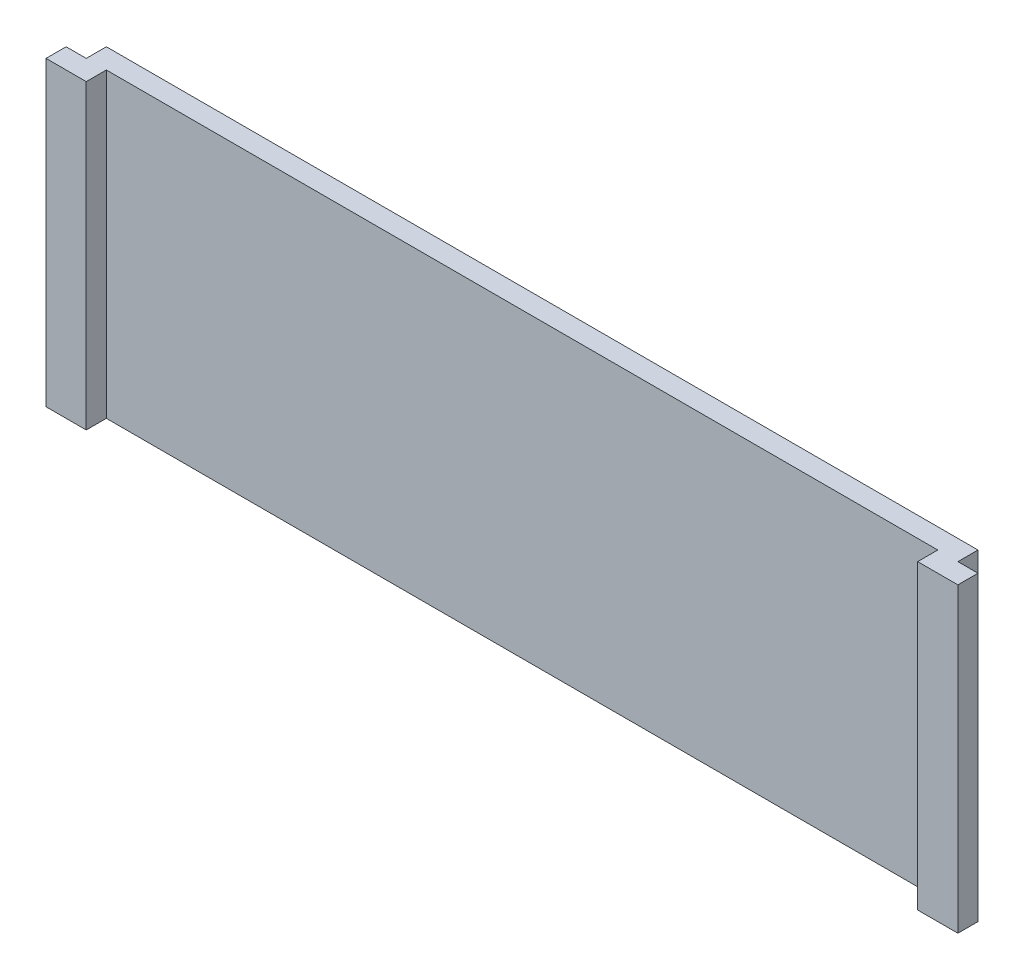
ISO-10303-21;
HEADER;
FILE_DESCRIPTION(('STEP AP214'),'2;1');
FILE_NAME('part.step','',(''),(''),'','','');
FILE_SCHEMA(('AUTOMOTIVE_DESIGN { 1 0 10303 214 1 1 1 1 }'));
ENDSEC;
DATA;
#1=APPLICATION_CONTEXT('core data for automotive mechanical design processes');
#2=APPLICATION_PROTOCOL_DEFINITION('international standard','automotive_design',2000,#1);
#3=PRODUCT_CONTEXT('',#1,'mechanical');
#4=PRODUCT('Part','Part','',(#3));
#5=PRODUCT_RELATED_PRODUCT_CATEGORY('part','',(#4));
#6=PRODUCT_DEFINITION_FORMATION('','',#4);
#7=PRODUCT_DEFINITION_CONTEXT('part definition',#1,'design');
#8=PRODUCT_DEFINITION('design','',#6,#7);
#9=PRODUCT_DEFINITION_SHAPE('','',#8);
#10=(LENGTH_UNIT() NAMED_UNIT(*) SI_UNIT(.MILLI.,.METRE.));
#11=(NAMED_UNIT(*) PLANE_ANGLE_UNIT() SI_UNIT($,.RADIAN.));
#12=(NAMED_UNIT(*) SI_UNIT($,.STERADIAN.) SOLID_ANGLE_UNIT());
#13=UNCERTAINTY_MEASURE_WITH_UNIT(LENGTH_MEASURE(1.E-05),#10,'distance_accuracy_value','');
#14=(GEOMETRIC_REPRESENTATION_CONTEXT(3) GLOBAL_UNCERTAINTY_ASSIGNED_CONTEXT((#13)) GLOBAL_UNIT_ASSIGNED_CONTEXT((#10,
#11,#12)) REPRESENTATION_CONTEXT('',''));
#15=CARTESIAN_POINT('',(0.,0.,0.));
#16=DIRECTION('',(0.,0.,1.));
#17=DIRECTION('',(1.,0.,0.));
#18=AXIS2_PLACEMENT_3D('',#15,#16,#17);
#19=CARTESIAN_POINT('',(0.,0.,3.));
#20=DIRECTION('',(0.,0.,1.));
#21=DIRECTION('',(1.,0.,0.));
#22=AXIS2_PLACEMENT_3D('',#19,#20,#21);
#23=PLANE('',#22);
#24=DIRECTION('',(1.,0.,0.));
#25=VECTOR('',#24,1.);
#26=CARTESIAN_POINT('',(-13.7646933247942,-11.2650602409639,3.));
#27=LINE('',#26,#25);
#28=CARTESIAN_POINT('',(-10.7646933247942,-11.2650602409639,3.));
#29=VERTEX_POINT('',#28);
#30=CARTESIAN_POINT('',(113.235306675206,-11.2650602409639,3.));
#31=VERTEX_POINT('',#30);
#32=EDGE_CURVE('E57',#29,#31,#27,.T.);
#33=ORIENTED_EDGE('',*,*,#32,.T.);
#34=DIRECTION('',(0.,-1.,0.));
#35=VECTOR('',#34,1.);
#36=CARTESIAN_POINT('',(113.235306675206,0.,3.));
#37=LINE('',#36,#35);
#38=CARTESIAN_POINT('',(113.235306675206,33.7349397590361,3.));
#39=VERTEX_POINT('',#38);
#40=EDGE_CURVE('E175',#39,#31,#37,.T.);
#41=ORIENTED_EDGE('',*,*,#40,.F.);
#42=DIRECTION('',(-1.,0.,0.));
#43=VECTOR('',#42,1.);
#44=CARTESIAN_POINT('',(-13.7646933247942,33.7349397590361,3.));
#45=LINE('',#44,#43);
#46=CARTESIAN_POINT('',(-10.7646933247942,33.7349397590361,3.));
#47=VERTEX_POINT('',#46);
#48=EDGE_CURVE('E239',#39,#47,#45,.T.);
#49=ORIENTED_EDGE('',*,*,#48,.T.);
#50=DIRECTION('',(0.,-1.,0.));
#51=VECTOR('',#50,1.);
#52=CARTESIAN_POINT('',(-10.7646933247942,0.,3.));
#53=LINE('',#52,#51);
#54=EDGE_CURVE('E210',#47,#29,#53,.T.);
#55=ORIENTED_EDGE('',*,*,#54,.T.);
#56=EDGE_LOOP('',(#33,#41,#49,#55));
#57=FACE_BOUND('',#56,.T.);
#58=ADVANCED_FACE('F41',(#57),#23,.T.);
#59=CARTESIAN_POINT('',(-13.7646933247942,33.7349397590361,3.));
#60=DIRECTION('',(1.,0.,0.));
#61=DIRECTION('',(0.,1.,0.));
#62=AXIS2_PLACEMENT_3D('',#59,#60,#61);
#63=PLANE('',#62);
#64=DIRECTION('',(0.,-1.,0.));
#65=VECTOR('',#64,1.);
#66=CARTESIAN_POINT('',(-13.7646933247942,33.7349397590361,0.));
#67=LINE('',#66,#65);
#68=CARTESIAN_POINT('',(-13.7646933247942,33.7349397590361,0.));
#69=VERTEX_POINT('',#68);
#70=CARTESIAN_POINT('',(-13.7646933247942,-11.2650602409639,0.));
#71=VERTEX_POINT('',#70);
#72=EDGE_CURVE('E228',#69,#71,#67,.T.);
#73=ORIENTED_EDGE('',*,*,#72,.T.);
#74=DIRECTION('',(0.,0.,-1.));
#75=VECTOR('',#74,1.);
#76=CARTESIAN_POINT('',(-13.7646933247942,-11.2650602409639,3.));
#77=LINE('',#76,#75);
#78=CARTESIAN_POINT('',(-13.7646933247942,-11.2650602409639,3.));
#79=VERTEX_POINT('',#78);
#80=EDGE_CURVE('E11',#79,#71,#77,.T.);
#81=ORIENTED_EDGE('',*,*,#80,.F.);
#82=DIRECTION('',(0.,-1.,0.));
#83=VECTOR('',#82,1.);
#84=CARTESIAN_POINT('',(-13.7646933247942,33.7349397590361,3.));
#85=LINE('',#84,#83);
#86=CARTESIAN_POINT('',(-13.7646933247942,33.7349397590361,3.));
#87=VERTEX_POINT('',#86);
#88=EDGE_CURVE('E229',#87,#79,#85,.T.);
#89=ORIENTED_EDGE('',*,*,#88,.F.);
#90=DIRECTION('',(0.,0.,-1.));
#91=VECTOR('',#90,1.);
#92=CARTESIAN_POINT('',(-13.7646933247942,33.7349397590361,3.));
#93=LINE('',#92,#91);
#94=EDGE_CURVE('E242',#87,#69,#93,.T.);
#95=ORIENTED_EDGE('',*,*,#94,.T.);
#96=EDGE_LOOP('',(#73,#81,#89,#95));
#97=FACE_BOUND('',#96,.T.);
#98=ADVANCED_FACE('F43',(#97),#63,.F.);
#99=CARTESIAN_POINT('',(-13.7646933247942,-11.2650602409639,3.));
#100=DIRECTION('',(0.,1.,0.));
#101=DIRECTION('',(0.,0.,1.));
#102=AXIS2_PLACEMENT_3D('',#99,#100,#101);
#103=PLANE('',#102);
#104=DIRECTION('',(1.,0.,0.));
#105=VECTOR('',#104,1.);
#106=CARTESIAN_POINT('',(-13.7646933247942,-11.2650602409639,0.));
#107=LINE('',#106,#105);
#108=CARTESIAN_POINT('',(116.235306675206,-11.2650602409639,0.));
#109=VERTEX_POINT('',#108);
#110=EDGE_CURVE('E246',#71,#109,#107,.T.);
#111=ORIENTED_EDGE('',*,*,#110,.T.);
#112=DIRECTION('',(0.,0.,-1.));
#113=VECTOR('',#112,1.);
#114=CARTESIAN_POINT('',(116.235306675206,-11.2650602409639,3.));
#115=LINE('',#114,#113);
#116=CARTESIAN_POINT('',(116.235306675206,-11.2650602409639,3.));
#117=VERTEX_POINT('',#116);
#118=EDGE_CURVE('E50',#117,#109,#115,.T.);
#119=ORIENTED_EDGE('',*,*,#118,.F.);
#120=DIRECTION('',(1.,0.,0.));
#121=VECTOR('',#120,1.);
#122=CARTESIAN_POINT('',(0.,-11.2650602409639,3.));
#123=LINE('',#122,#121);
#124=CARTESIAN_POINT('',(119.235306675206,-11.2650602409638,3.));
#125=VERTEX_POINT('',#124);
#126=EDGE_CURVE('E156',#117,#125,#123,.T.);
#127=ORIENTED_EDGE('',*,*,#126,.T.);
#128=DIRECTION('',(0.,0.,-1.));
#129=VECTOR('',#128,1.);
#130=CARTESIAN_POINT('',(119.235306675206,-11.2650602409638,6.));
#131=LINE('',#130,#129);
#132=CARTESIAN_POINT('',(119.235306675206,-11.2650602409638,6.));
#133=VERTEX_POINT('',#132);
#134=EDGE_CURVE('E169',#133,#125,#131,.T.);
#135=ORIENTED_EDGE('',*,*,#134,.F.);
#136=DIRECTION('',(1.,0.,0.));
#137=VECTOR('',#136,1.);
#138=CARTESIAN_POINT('',(0.,-11.2650602409639,6.));
#139=LINE('',#138,#137);
#140=CARTESIAN_POINT('',(113.235306675206,-11.2650602409639,6.));
#141=VERTEX_POINT('',#140);
#142=EDGE_CURVE('E153',#141,#133,#139,.T.);
#143=ORIENTED_EDGE('',*,*,#142,.F.);
#144=DIRECTION('',(0.,0.,-1.));
#145=VECTOR('',#144,1.);
#146=CARTESIAN_POINT('',(113.235306675206,-11.2650602409639,6.));
#147=LINE('',#146,#145);
#148=EDGE_CURVE('E182',#141,#31,#147,.T.);
#149=ORIENTED_EDGE('',*,*,#148,.T.);
#150=ORIENTED_EDGE('',*,*,#32,.F.);
#151=DIRECTION('',(0.,0.,-1.));
#152=VECTOR('',#151,1.);
#153=CARTESIAN_POINT('',(-10.7646933247942,-11.2650602409639,6.));
#154=LINE('',#153,#152);
#155=CARTESIAN_POINT('',(-10.7646933247942,-11.2650602409639,6.));
#156=VERTEX_POINT('',#155);
#157=EDGE_CURVE('E65',#156,#29,#154,.T.);
#158=ORIENTED_EDGE('',*,*,#157,.F.);
#159=DIRECTION('',(-1.,0.,0.));
#160=VECTOR('',#159,1.);
#161=CARTESIAN_POINT('',(0.,-11.2650602409639,6.));
#162=LINE('',#161,#160);
#163=CARTESIAN_POINT('',(-16.7646933247942,-11.2650602409639,6.));
#164=VERTEX_POINT('',#163);
#165=EDGE_CURVE('E192',#156,#164,#162,.T.);
#166=ORIENTED_EDGE('',*,*,#165,.T.);
#167=DIRECTION('',(0.,0.,-1.));
#168=VECTOR('',#167,1.);
#169=CARTESIAN_POINT('',(-16.7646933247942,-11.2650602409639,6.));
#170=LINE('',#169,#168);
#171=CARTESIAN_POINT('',(-16.7646933247942,-11.2650602409639,3.));
#172=VERTEX_POINT('',#171);
#173=EDGE_CURVE('E224',#164,#172,#170,.T.);
#174=ORIENTED_EDGE('',*,*,#173,.T.);
#175=DIRECTION('',(-1.,0.,0.));
#176=VECTOR('',#175,1.);
#177=CARTESIAN_POINT('',(0.,-11.2650602409639,3.));
#178=LINE('',#177,#176);
#179=EDGE_CURVE('E207',#79,#172,#178,.T.);
#180=ORIENTED_EDGE('',*,*,#179,.F.);
#181=ORIENTED_EDGE('',*,*,#80,.T.);
#182=EDGE_LOOP('',(#111,#119,#127,#135,#143,#149,#150,#158,#166,#174,#180,#181));
#183=FACE_BOUND('',#182,.T.);
#184=ADVANCED_FACE('F279',(#183),#103,.F.);
#185=CARTESIAN_POINT('',(116.235306675206,33.7349397590361,3.));
#186=DIRECTION('',(-1.,0.,0.));
#187=DIRECTION('',(0.,0.,1.));
#188=AXIS2_PLACEMENT_3D('',#185,#186,#187);
#189=PLANE('',#188);
#190=DIRECTION('',(0.,1.,0.));
#191=VECTOR('',#190,1.);
#192=CARTESIAN_POINT('',(116.235306675206,33.7349397590361,0.));
#193=LINE('',#192,#191);
#194=CARTESIAN_POINT('',(116.235306675206,33.7349397590361,0.));
#195=VERTEX_POINT('',#194);
#196=EDGE_CURVE('E249',#109,#195,#193,.T.);
#197=ORIENTED_EDGE('',*,*,#196,.T.);
#198=DIRECTION('',(0.,0.,-1.));
#199=VECTOR('',#198,1.);
#200=CARTESIAN_POINT('',(116.235306675206,33.7349397590361,3.));
#201=LINE('',#200,#199);
#202=CARTESIAN_POINT('',(116.235306675206,33.7349397590361,3.));
#203=VERTEX_POINT('',#202);
#204=EDGE_CURVE('E257',#203,#195,#201,.T.);
#205=ORIENTED_EDGE('',*,*,#204,.F.);
#206=DIRECTION('',(0.,1.,0.));
#207=VECTOR('',#206,1.);
#208=CARTESIAN_POINT('',(116.235306675206,33.7349397590361,3.));
#209=LINE('',#208,#207);
#210=EDGE_CURVE('E235',#117,#203,#209,.T.);
#211=ORIENTED_EDGE('',*,*,#210,.F.);
#212=ORIENTED_EDGE('',*,*,#118,.T.);
#213=EDGE_LOOP('',(#197,#205,#211,#212));
#214=FACE_BOUND('',#213,.T.);
#215=ADVANCED_FACE('F265',(#214),#189,.F.);
#216=CARTESIAN_POINT('',(-13.7646933247942,33.7349397590361,3.));
#217=DIRECTION('',(0.,-1.,0.));
#218=DIRECTION('',(0.,0.,-1.));
#219=AXIS2_PLACEMENT_3D('',#216,#217,#218);
#220=PLANE('',#219);
#221=DIRECTION('',(-1.,0.,0.));
#222=VECTOR('',#221,1.);
#223=CARTESIAN_POINT('',(-13.7646933247942,33.7349397590361,0.));
#224=LINE('',#223,#222);
#225=EDGE_CURVE('E232',#195,#69,#224,.T.);
#226=ORIENTED_EDGE('',*,*,#225,.T.);
#227=ORIENTED_EDGE('',*,*,#94,.F.);
#228=DIRECTION('',(-1.,0.,0.));
#229=VECTOR('',#228,1.);
#230=CARTESIAN_POINT('',(0.,33.7349397590361,3.));
#231=LINE('',#230,#229);
#232=CARTESIAN_POINT('',(-16.7646933247942,33.7349397590361,3.));
#233=VERTEX_POINT('',#232);
#234=EDGE_CURVE('E193',#87,#233,#231,.T.);
#235=ORIENTED_EDGE('',*,*,#234,.T.);
#236=DIRECTION('',(0.,0.,-1.));
#237=VECTOR('',#236,1.);
#238=CARTESIAN_POINT('',(-16.7646933247942,33.7349397590361,6.));
#239=LINE('',#238,#237);
#240=CARTESIAN_POINT('',(-16.7646933247942,33.7349397590361,6.));
#241=VERTEX_POINT('',#240);
#242=EDGE_CURVE('E203',#241,#233,#239,.T.);
#243=ORIENTED_EDGE('',*,*,#242,.F.);
#244=DIRECTION('',(-1.,0.,0.));
#245=VECTOR('',#244,1.);
#246=CARTESIAN_POINT('',(0.,33.7349397590361,6.));
#247=LINE('',#246,#245);
#248=CARTESIAN_POINT('',(-10.7646933247942,33.7349397590361,6.));
#249=VERTEX_POINT('',#248);
#250=EDGE_CURVE('E200',#249,#241,#247,.T.);
#251=ORIENTED_EDGE('',*,*,#250,.F.);
#252=DIRECTION('',(0.,0.,-1.));
#253=VECTOR('',#252,1.);
#254=CARTESIAN_POINT('',(-10.7646933247942,33.7349397590361,6.));
#255=LINE('',#254,#253);
#256=EDGE_CURVE('E218',#249,#47,#255,.T.);
#257=ORIENTED_EDGE('',*,*,#256,.T.);
#258=ORIENTED_EDGE('',*,*,#48,.F.);
#259=DIRECTION('',(0.,0.,-1.));
#260=VECTOR('',#259,1.);
#261=CARTESIAN_POINT('',(113.235306675206,33.7349397590361,6.));
#262=LINE('',#261,#260);
#263=CARTESIAN_POINT('',(113.235306675206,33.7349397590361,6.));
#264=VERTEX_POINT('',#263);
#265=EDGE_CURVE('E146',#264,#39,#262,.T.);
#266=ORIENTED_EDGE('',*,*,#265,.F.);
#267=DIRECTION('',(1.,0.,0.));
#268=VECTOR('',#267,1.);
#269=CARTESIAN_POINT('',(0.,33.7349397590361,6.));
#270=LINE('',#269,#268);
#271=CARTESIAN_POINT('',(119.235306675206,33.7349397590361,6.));
#272=VERTEX_POINT('',#271);
#273=EDGE_CURVE('E151',#264,#272,#270,.T.);
#274=ORIENTED_EDGE('',*,*,#273,.T.);
#275=DIRECTION('',(0.,0.,-1.));
#276=VECTOR('',#275,1.);
#277=CARTESIAN_POINT('',(119.235306675206,33.7349397590361,6.));
#278=LINE('',#277,#276);
#279=CARTESIAN_POINT('',(119.235306675206,33.7349397590361,3.));
#280=VERTEX_POINT('',#279);
#281=EDGE_CURVE('E134',#272,#280,#278,.T.);
#282=ORIENTED_EDGE('',*,*,#281,.T.);
#283=DIRECTION('',(1.,0.,0.));
#284=VECTOR('',#283,1.);
#285=CARTESIAN_POINT('',(0.,33.7349397590361,3.));
#286=LINE('',#285,#284);
#287=EDGE_CURVE('E172',#203,#280,#286,.T.);
#288=ORIENTED_EDGE('',*,*,#287,.F.);
#289=ORIENTED_EDGE('',*,*,#204,.T.);
#290=EDGE_LOOP('',(#226,#227,#235,#243,#251,#257,#258,#266,#274,#282,#288,#289));
#291=FACE_BOUND('',#290,.T.);
#292=ADVANCED_FACE('F158',(#291),#220,.F.);
#293=CARTESIAN_POINT('',(0.,0.,0.));
#294=DIRECTION('',(0.,0.,1.));
#295=DIRECTION('',(1.,0.,0.));
#296=AXIS2_PLACEMENT_3D('',#293,#294,#295);
#297=PLANE('',#296);
#298=ORIENTED_EDGE('',*,*,#72,.F.);
#299=ORIENTED_EDGE('',*,*,#225,.F.);
#300=ORIENTED_EDGE('',*,*,#196,.F.);
#301=ORIENTED_EDGE('',*,*,#110,.F.);
#302=EDGE_LOOP('',(#298,#299,#300,#301));
#303=FACE_BOUND('',#302,.T.);
#304=ADVANCED_FACE('F271',(#303),#297,.F.);
#305=CARTESIAN_POINT('',(0.,0.,3.));
#306=DIRECTION('',(0.,0.,1.));
#307=DIRECTION('',(1.,0.,0.));
#308=AXIS2_PLACEMENT_3D('',#305,#306,#307);
#309=PLANE('',#308);
#310=ORIENTED_EDGE('',*,*,#234,.F.);
#311=ORIENTED_EDGE('',*,*,#88,.T.);
#312=ORIENTED_EDGE('',*,*,#179,.T.);
#313=DIRECTION('',(0.,1.,0.));
#314=VECTOR('',#313,1.);
#315=CARTESIAN_POINT('',(-16.7646933247942,0.,3.));
#316=LINE('',#315,#314);
#317=EDGE_CURVE('E145',#172,#233,#316,.T.);
#318=ORIENTED_EDGE('',*,*,#317,.T.);
#319=EDGE_LOOP('',(#310,#311,#312,#318));
#320=FACE_BOUND('',#319,.T.);
#321=ADVANCED_FACE('F278',(#320),#309,.F.);
#322=CARTESIAN_POINT('',(-16.7646933247942,0.,6.));
#323=DIRECTION('',(-1.,0.,0.));
#324=DIRECTION('',(0.,-1.,0.));
#325=AXIS2_PLACEMENT_3D('',#322,#323,#324);
#326=PLANE('',#325);
#327=ORIENTED_EDGE('',*,*,#317,.F.);
#328=ORIENTED_EDGE('',*,*,#173,.F.);
#329=DIRECTION('',(0.,1.,0.));
#330=VECTOR('',#329,1.);
#331=CARTESIAN_POINT('',(-16.7646933247942,0.,6.));
#332=LINE('',#331,#330);
#333=EDGE_CURVE('E188',#164,#241,#332,.T.);
#334=ORIENTED_EDGE('',*,*,#333,.T.);
#335=ORIENTED_EDGE('',*,*,#242,.T.);
#336=EDGE_LOOP('',(#327,#328,#334,#335));
#337=FACE_BOUND('',#336,.T.);
#338=ADVANCED_FACE('F284',(#337),#326,.T.);
#339=CARTESIAN_POINT('',(-10.7646933247942,0.,6.));
#340=DIRECTION('',(1.,0.,0.));
#341=DIRECTION('',(0.,1.,0.));
#342=AXIS2_PLACEMENT_3D('',#339,#340,#341);
#343=PLANE('',#342);
#344=ORIENTED_EDGE('',*,*,#54,.F.);
#345=ORIENTED_EDGE('',*,*,#256,.F.);
#346=DIRECTION('',(0.,-1.,0.));
#347=VECTOR('',#346,1.);
#348=CARTESIAN_POINT('',(-10.7646933247942,0.,6.));
#349=LINE('',#348,#347);
#350=EDGE_CURVE('E197',#249,#156,#349,.T.);
#351=ORIENTED_EDGE('',*,*,#350,.T.);
#352=ORIENTED_EDGE('',*,*,#157,.T.);
#353=EDGE_LOOP('',(#344,#345,#351,#352));
#354=FACE_BOUND('',#353,.T.);
#355=ADVANCED_FACE('F290',(#354),#343,.T.);
#356=CARTESIAN_POINT('',(0.,0.,6.));
#357=DIRECTION('',(0.,0.,1.));
#358=DIRECTION('',(1.,0.,0.));
#359=AXIS2_PLACEMENT_3D('',#356,#357,#358);
#360=PLANE('',#359);
#361=ORIENTED_EDGE('',*,*,#333,.F.);
#362=ORIENTED_EDGE('',*,*,#165,.F.);
#363=ORIENTED_EDGE('',*,*,#350,.F.);
#364=ORIENTED_EDGE('',*,*,#250,.T.);
#365=EDGE_LOOP('',(#361,#362,#363,#364));
#366=FACE_BOUND('',#365,.T.);
#367=ADVANCED_FACE('F289',(#366),#360,.T.);
#368=CARTESIAN_POINT('',(0.,0.,3.));
#369=DIRECTION('',(0.,0.,1.));
#370=DIRECTION('',(1.,0.,0.));
#371=AXIS2_PLACEMENT_3D('',#368,#369,#370);
#372=PLANE('',#371);
#373=ORIENTED_EDGE('',*,*,#126,.F.);
#374=ORIENTED_EDGE('',*,*,#210,.T.);
#375=ORIENTED_EDGE('',*,*,#287,.T.);
#376=DIRECTION('',(0.,-1.,0.));
#377=VECTOR('',#376,1.);
#378=CARTESIAN_POINT('',(119.235306675206,0.,3.));
#379=LINE('',#378,#377);
#380=EDGE_CURVE('E140',#280,#125,#379,.T.);
#381=ORIENTED_EDGE('',*,*,#380,.T.);
#382=EDGE_LOOP('',(#373,#374,#375,#381));
#383=FACE_BOUND('',#382,.T.);
#384=ADVANCED_FACE('F301',(#383),#372,.F.);
#385=CARTESIAN_POINT('',(119.235306675206,0.,6.));
#386=DIRECTION('',(1.,0.,0.));
#387=DIRECTION('',(0.,0.,-1.));
#388=AXIS2_PLACEMENT_3D('',#385,#386,#387);
#389=PLANE('',#388);
#390=ORIENTED_EDGE('',*,*,#380,.F.);
#391=ORIENTED_EDGE('',*,*,#281,.F.);
#392=DIRECTION('',(0.,-1.,0.));
#393=VECTOR('',#392,1.);
#394=CARTESIAN_POINT('',(119.235306675206,0.,6.));
#395=LINE('',#394,#393);
#396=EDGE_CURVE('E138',#272,#133,#395,.T.);
#397=ORIENTED_EDGE('',*,*,#396,.T.);
#398=ORIENTED_EDGE('',*,*,#134,.T.);
#399=EDGE_LOOP('',(#390,#391,#397,#398));
#400=FACE_BOUND('',#399,.T.);
#401=ADVANCED_FACE('F136',(#400),#389,.T.);
#402=CARTESIAN_POINT('',(113.235306675206,0.,6.));
#403=DIRECTION('',(1.,0.,0.));
#404=DIRECTION('',(0.,1.,0.));
#405=AXIS2_PLACEMENT_3D('',#402,#403,#404);
#406=PLANE('',#405);
#407=ORIENTED_EDGE('',*,*,#40,.T.);
#408=ORIENTED_EDGE('',*,*,#148,.F.);
#409=DIRECTION('',(0.,-1.,0.));
#410=VECTOR('',#409,1.);
#411=CARTESIAN_POINT('',(113.235306675206,0.,6.));
#412=LINE('',#411,#410);
#413=EDGE_CURVE('E162',#264,#141,#412,.T.);
#414=ORIENTED_EDGE('',*,*,#413,.F.);
#415=ORIENTED_EDGE('',*,*,#265,.T.);
#416=EDGE_LOOP('',(#407,#408,#414,#415));
#417=FACE_BOUND('',#416,.T.);
#418=ADVANCED_FACE('F293',(#417),#406,.F.);
#419=CARTESIAN_POINT('',(0.,0.,6.));
#420=DIRECTION('',(0.,0.,1.));
#421=DIRECTION('',(1.,0.,0.));
#422=AXIS2_PLACEMENT_3D('',#419,#420,#421);
#423=PLANE('',#422);
#424=ORIENTED_EDGE('',*,*,#396,.F.);
#425=ORIENTED_EDGE('',*,*,#273,.F.);
#426=ORIENTED_EDGE('',*,*,#413,.T.);
#427=ORIENTED_EDGE('',*,*,#142,.T.);
#428=EDGE_LOOP('',(#424,#425,#426,#427));
#429=FACE_BOUND('',#428,.T.);
#430=ADVANCED_FACE('F150',(#429),#423,.T.);
#431=CLOSED_SHELL('',(#58,#98,#184,#215,#292,#304,#321,#338,#355,#367,#384,#401,#418,#430));
#432=MANIFOLD_SOLID_BREP('B2',#431);
#433=ADVANCED_BREP_SHAPE_REPRESENTATION('',(#18,#432),#14);
#434=SHAPE_DEFINITION_REPRESENTATION(#9,#433);
ENDSEC;
END-ISO-10303-21;
